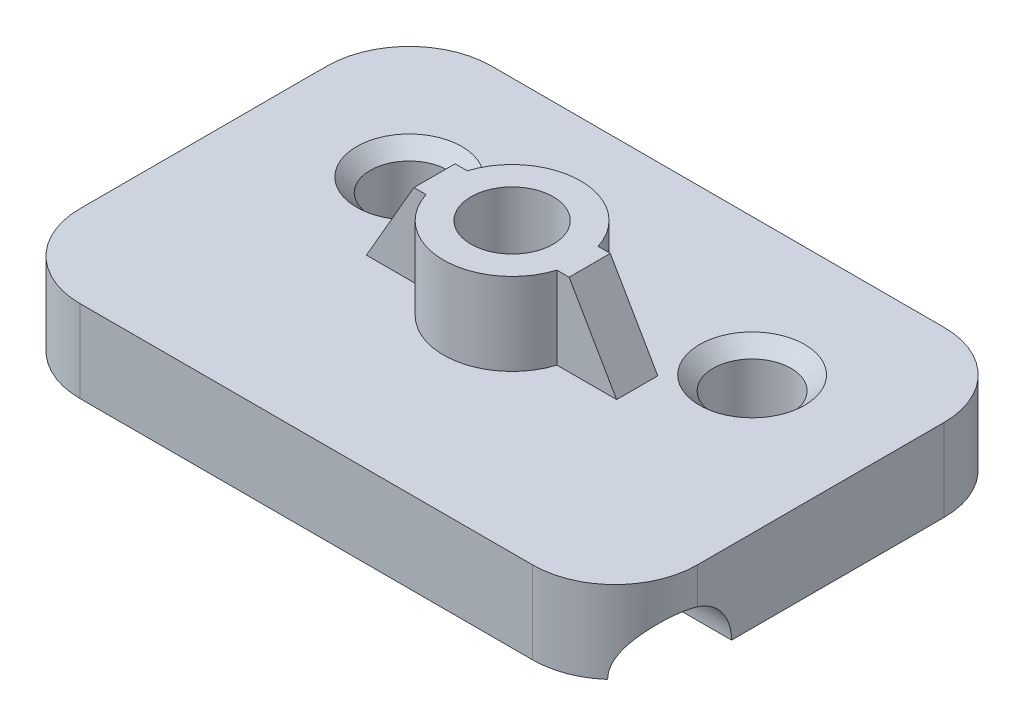
ISO-10303-21;
HEADER;
FILE_DESCRIPTION(('STEP AP214'),'2;1');
FILE_NAME('part.step','',(''),(''),'','','');
FILE_SCHEMA(('AUTOMOTIVE_DESIGN { 1 0 10303 214 1 1 1 1 }'));
ENDSEC;
DATA;
#1=APPLICATION_CONTEXT('core data for automotive mechanical design processes');
#2=APPLICATION_PROTOCOL_DEFINITION('international standard','automotive_design',2000,#1);
#3=PRODUCT_CONTEXT('',#1,'mechanical');
#4=PRODUCT('Part','Part','',(#3));
#5=PRODUCT_RELATED_PRODUCT_CATEGORY('part','',(#4));
#6=PRODUCT_DEFINITION_FORMATION('','',#4);
#7=PRODUCT_DEFINITION_CONTEXT('part definition',#1,'design');
#8=PRODUCT_DEFINITION('design','',#6,#7);
#9=PRODUCT_DEFINITION_SHAPE('','',#8);
#10=(LENGTH_UNIT() NAMED_UNIT(*) SI_UNIT(.MILLI.,.METRE.));
#11=(NAMED_UNIT(*) PLANE_ANGLE_UNIT() SI_UNIT($,.RADIAN.));
#12=(NAMED_UNIT(*) SI_UNIT($,.STERADIAN.) SOLID_ANGLE_UNIT());
#13=UNCERTAINTY_MEASURE_WITH_UNIT(LENGTH_MEASURE(1.E-05),#10,'distance_accuracy_value','');
#14=(GEOMETRIC_REPRESENTATION_CONTEXT(3) GLOBAL_UNCERTAINTY_ASSIGNED_CONTEXT((#13)) GLOBAL_UNIT_ASSIGNED_CONTEXT((#10,
#11,#12)) REPRESENTATION_CONTEXT('',''));
#15=CARTESIAN_POINT('',(0.,0.,0.));
#16=DIRECTION('',(0.,0.,1.));
#17=DIRECTION('',(1.,0.,0.));
#18=AXIS2_PLACEMENT_3D('',#15,#16,#17);
#19=CARTESIAN_POINT('',(-16.5,0.,-9.));
#20=DIRECTION('',(0.,-1.,0.));
#21=DIRECTION('',(0.,0.,-1.));
#22=AXIS2_PLACEMENT_3D('',#19,#20,#21);
#23=PLANE('',#22);
#24=CARTESIAN_POINT('',(12.5,0.,-5.));
#25=DIRECTION('',(0.,-1.,0.));
#26=DIRECTION('',(0.,0.,-1.));
#27=AXIS2_PLACEMENT_3D('',#24,#25,#26);
#28=CIRCLE('',#27,3.8381748737515);
#29=CARTESIAN_POINT('',(12.5,0.,-8.8381748737515));
#30=VERTEX_POINT('',#29);
#31=EDGE_CURVE('E244',#30,#30,#28,.F.);
#32=ORIENTED_EDGE('',*,*,#31,.T.);
#33=EDGE_LOOP('',(#32));
#34=FACE_BOUND('',#33,.T.);
#35=CARTESIAN_POINT('',(-12.5,0.,-5.));
#36=DIRECTION('',(0.,-1.,0.));
#37=DIRECTION('',(0.,0.,-1.));
#38=AXIS2_PLACEMENT_3D('',#35,#36,#37);
#39=CIRCLE('',#38,3.8381748737515);
#40=CARTESIAN_POINT('',(-12.5,0.,-8.8381748737515));
#41=VERTEX_POINT('',#40);
#42=EDGE_CURVE('E241',#41,#41,#39,.F.);
#43=ORIENTED_EDGE('',*,*,#42,.T.);
#44=EDGE_LOOP('',(#43));
#45=FACE_BOUND('',#44,.T.);
#46=DIRECTION('',(1.,0.,0.));
#47=VECTOR('',#46,1.);
#48=CARTESIAN_POINT('',(-32.3994949366117,0.,6.5));
#49=LINE('',#48,#47);
#50=CARTESIAN_POINT('',(-22.5,0.,6.5));
#51=VERTEX_POINT('',#50);
#52=CARTESIAN_POINT('',(22.5,0.,6.5));
#53=VERTEX_POINT('',#52);
#54=EDGE_CURVE('E49',#51,#53,#49,.T.);
#55=ORIENTED_EDGE('',*,*,#54,.F.);
#56=DIRECTION('',(0.,0.,1.));
#57=VECTOR('',#56,1.);
#58=CARTESIAN_POINT('',(-22.5,0.,-8.99999999999996));
#59=LINE('',#58,#57);
#60=CARTESIAN_POINT('',(-22.5,0.,-8.99999999999996));
#61=VERTEX_POINT('',#60);
#62=EDGE_CURVE('E172',#61,#51,#59,.T.);
#63=ORIENTED_EDGE('',*,*,#62,.F.);
#64=CARTESIAN_POINT('',(-16.5,0.,-9.));
#65=DIRECTION('',(0.,1.,0.));
#66=DIRECTION('',(0.,0.,-1.));
#67=AXIS2_PLACEMENT_3D('',#64,#65,#66);
#68=CIRCLE('',#67,6.);
#69=CARTESIAN_POINT('',(-16.5,0.,-15.));
#70=VERTEX_POINT('',#69);
#71=EDGE_CURVE('E183',#70,#61,#68,.T.);
#72=ORIENTED_EDGE('',*,*,#71,.F.);
#73=DIRECTION('',(-1.,0.,0.));
#74=VECTOR('',#73,1.);
#75=CARTESIAN_POINT('',(-16.5,0.,-15.));
#76=LINE('',#75,#74);
#77=CARTESIAN_POINT('',(16.5,0.,-15.));
#78=VERTEX_POINT('',#77);
#79=EDGE_CURVE('E198',#78,#70,#76,.T.);
#80=ORIENTED_EDGE('',*,*,#79,.F.);
#81=CARTESIAN_POINT('',(16.5,0.,-9.));
#82=DIRECTION('',(0.,1.,0.));
#83=DIRECTION('',(0.,0.,1.));
#84=AXIS2_PLACEMENT_3D('',#81,#82,#83);
#85=CIRCLE('',#84,6.);
#86=CARTESIAN_POINT('',(22.5,0.,-8.99999999999996));
#87=VERTEX_POINT('',#86);
#88=EDGE_CURVE('E196',#87,#78,#85,.T.);
#89=ORIENTED_EDGE('',*,*,#88,.F.);
#90=DIRECTION('',(0.,0.,-1.));
#91=VECTOR('',#90,1.);
#92=CARTESIAN_POINT('',(22.5,0.,-8.99999999999996));
#93=LINE('',#92,#91);
#94=EDGE_CURVE('E175',#53,#87,#93,.T.);
#95=ORIENTED_EDGE('',*,*,#94,.F.);
#96=EDGE_LOOP('',(#55,#63,#72,#80,#89,#95));
#97=FACE_BOUND('',#96,.T.);
#98=CARTESIAN_POINT('',(0.,0.,0.));
#99=DIRECTION('',(0.,1.,0.));
#100=DIRECTION('',(0.,0.,1.));
#101=AXIS2_PLACEMENT_3D('',#98,#99,#100);
#102=CIRCLE('',#101,3.);
#103=CARTESIAN_POINT('',(0.,0.,3.));
#104=VERTEX_POINT('',#103);
#105=EDGE_CURVE('E187',#104,#104,#102,.T.);
#106=ORIENTED_EDGE('',*,*,#105,.T.);
#107=EDGE_LOOP('',(#106));
#108=FACE_BOUND('',#107,.T.);
#109=ADVANCED_FACE('F34',(#34,#45,#97,#108),#23,.T.);
#110=CARTESIAN_POINT('',(0.,12.,0.));
#111=DIRECTION('',(0.,-1.,0.));
#112=DIRECTION('',(0.,0.,-1.));
#113=AXIS2_PLACEMENT_3D('',#110,#111,#112);
#114=CYLINDRICAL_SURFACE('',#113,5.);
#115=DIRECTION('',(0.,-1.,0.));
#116=VECTOR('',#115,1.);
#117=CARTESIAN_POINT('',(4.76969600708473,12.,-1.5));
#118=LINE('',#117,#116);
#119=CARTESIAN_POINT('',(4.76969600708473,6.,-1.5));
#120=VERTEX_POINT('',#119);
#121=CARTESIAN_POINT('',(4.76969600708473,12.,-1.5));
#122=VERTEX_POINT('',#121);
#123=EDGE_CURVE('E230',#120,#122,#118,.F.);
#124=ORIENTED_EDGE('',*,*,#123,.F.);
#125=CARTESIAN_POINT('',(0.,6.,0.));
#126=DIRECTION('',(0.,1.,0.));
#127=DIRECTION('',(0.,0.,1.));
#128=AXIS2_PLACEMENT_3D('',#125,#126,#127);
#129=CIRCLE('',#128,5.);
#130=CARTESIAN_POINT('',(-4.76969600708473,6.,-1.5));
#131=VERTEX_POINT('',#130);
#132=EDGE_CURVE('E223',#120,#131,#129,.T.);
#133=ORIENTED_EDGE('',*,*,#132,.T.);
#134=DIRECTION('',(0.,-1.,0.));
#135=VECTOR('',#134,1.);
#136=CARTESIAN_POINT('',(-4.76969600708473,12.,-1.5));
#137=LINE('',#136,#135);
#138=CARTESIAN_POINT('',(-4.76969600708473,12.,-1.5));
#139=VERTEX_POINT('',#138);
#140=EDGE_CURVE('E224',#139,#131,#137,.T.);
#141=ORIENTED_EDGE('',*,*,#140,.F.);
#142=CARTESIAN_POINT('',(0.,12.,0.));
#143=DIRECTION('',(0.,1.,0.));
#144=DIRECTION('',(0.,0.,1.));
#145=AXIS2_PLACEMENT_3D('',#142,#143,#144);
#146=CIRCLE('',#145,5.);
#147=EDGE_CURVE('E607',#122,#139,#146,.T.);
#148=ORIENTED_EDGE('',*,*,#147,.F.);
#149=EDGE_LOOP('',(#124,#133,#141,#148));
#150=FACE_BOUND('',#149,.T.);
#151=ADVANCED_FACE('F267',(#150),#114,.T.);
#152=CARTESIAN_POINT('',(-16.5,6.,-9.));
#153=DIRECTION('',(0.,-1.,0.));
#154=DIRECTION('',(0.,0.,-1.));
#155=AXIS2_PLACEMENT_3D('',#152,#153,#154);
#156=PLANE('',#155);
#157=CARTESIAN_POINT('',(-12.5,6.,-5.));
#158=DIRECTION('',(0.,-1.,0.));
#159=DIRECTION('',(0.,0.,-1.));
#160=AXIS2_PLACEMENT_3D('',#157,#158,#159);
#161=CIRCLE('',#160,3.8381748737515);
#162=CARTESIAN_POINT('',(-12.5,6.,-8.83817487375149));
#163=VERTEX_POINT('',#162);
#164=EDGE_CURVE('E11',#163,#163,#161,.T.);
#165=ORIENTED_EDGE('',*,*,#164,.T.);
#166=EDGE_LOOP('',(#165));
#167=FACE_BOUND('',#166,.T.);
#168=CARTESIAN_POINT('',(12.5,6.,-5.));
#169=DIRECTION('',(0.,-1.,0.));
#170=DIRECTION('',(0.,0.,-1.));
#171=AXIS2_PLACEMENT_3D('',#168,#169,#170);
#172=CIRCLE('',#171,3.8381748737515);
#173=CARTESIAN_POINT('',(12.5,6.,-8.83817487375149));
#174=VERTEX_POINT('',#173);
#175=EDGE_CURVE('E42',#174,#174,#172,.T.);
#176=ORIENTED_EDGE('',*,*,#175,.T.);
#177=EDGE_LOOP('',(#176));
#178=FACE_BOUND('',#177,.T.);
#179=DIRECTION('',(0.,0.,-1.));
#180=VECTOR('',#179,1.);
#181=CARTESIAN_POINT('',(9.1218522547401,6.,1.5));
#182=LINE('',#181,#180);
#183=CARTESIAN_POINT('',(9.1218522547401,6.,1.5));
#184=VERTEX_POINT('',#183);
#185=CARTESIAN_POINT('',(9.1218522547401,6.,-1.5));
#186=VERTEX_POINT('',#185);
#187=EDGE_CURVE('E57',#184,#186,#182,.T.);
#188=ORIENTED_EDGE('',*,*,#187,.F.);
#189=DIRECTION('',(1.,0.,0.));
#190=VECTOR('',#189,1.);
#191=CARTESIAN_POINT('',(3.79854534632678,6.,1.5));
#192=LINE('',#191,#190);
#193=CARTESIAN_POINT('',(4.76969600708473,6.,1.5));
#194=VERTEX_POINT('',#193);
#195=EDGE_CURVE('E645',#194,#184,#192,.T.);
#196=ORIENTED_EDGE('',*,*,#195,.F.);
#197=CARTESIAN_POINT('',(-4.76969600708473,6.,1.5));
#198=VERTEX_POINT('',#197);
#199=EDGE_CURVE('E228',#198,#194,#129,.T.);
#200=ORIENTED_EDGE('',*,*,#199,.F.);
#201=DIRECTION('',(1.,0.,0.));
#202=VECTOR('',#201,1.);
#203=CARTESIAN_POINT('',(-3.79854534632678,6.,1.5));
#204=LINE('',#203,#202);
#205=CARTESIAN_POINT('',(-9.1218522547401,6.,1.5));
#206=VERTEX_POINT('',#205);
#207=EDGE_CURVE('E620',#206,#198,#204,.T.);
#208=ORIENTED_EDGE('',*,*,#207,.F.);
#209=DIRECTION('',(0.,0.,-1.));
#210=VECTOR('',#209,1.);
#211=CARTESIAN_POINT('',(-9.1218522547401,6.,1.5));
#212=LINE('',#211,#210);
#213=CARTESIAN_POINT('',(-9.1218522547401,6.,-1.5));
#214=VERTEX_POINT('',#213);
#215=EDGE_CURVE('E614',#206,#214,#212,.T.);
#216=ORIENTED_EDGE('',*,*,#215,.T.);
#217=DIRECTION('',(1.,0.,0.));
#218=VECTOR('',#217,1.);
#219=CARTESIAN_POINT('',(-3.79854534632678,6.,-1.5));
#220=LINE('',#219,#218);
#221=EDGE_CURVE('E623',#214,#131,#220,.T.);
#222=ORIENTED_EDGE('',*,*,#221,.T.);
#223=ORIENTED_EDGE('',*,*,#132,.F.);
#224=DIRECTION('',(1.,0.,0.));
#225=VECTOR('',#224,1.);
#226=CARTESIAN_POINT('',(3.79854534632678,6.,-1.5));
#227=LINE('',#226,#225);
#228=EDGE_CURVE('E640',#120,#186,#227,.T.);
#229=ORIENTED_EDGE('',*,*,#228,.T.);
#230=EDGE_LOOP('',(#188,#196,#200,#208,#216,#222,#223,#229));
#231=FACE_BOUND('',#230,.T.);
#232=CARTESIAN_POINT('',(-16.5,6.,-9.));
#233=DIRECTION('',(0.,1.,0.));
#234=DIRECTION('',(0.,0.,-1.));
#235=AXIS2_PLACEMENT_3D('',#232,#233,#234);
#236=CIRCLE('',#235,6.);
#237=CARTESIAN_POINT('',(-16.5,6.,-15.));
#238=VERTEX_POINT('',#237);
#239=CARTESIAN_POINT('',(-22.5,6.,-8.99999999999996));
#240=VERTEX_POINT('',#239);
#241=EDGE_CURVE('E200',#238,#240,#236,.T.);
#242=ORIENTED_EDGE('',*,*,#241,.T.);
#243=DIRECTION('',(0.,0.,1.));
#244=VECTOR('',#243,1.);
#245=CARTESIAN_POINT('',(-22.5,6.,-8.99999999999996));
#246=LINE('',#245,#244);
#247=CARTESIAN_POINT('',(-22.5,6.,8.99999999999996));
#248=VERTEX_POINT('',#247);
#249=EDGE_CURVE('E595',#240,#248,#246,.T.);
#250=ORIENTED_EDGE('',*,*,#249,.T.);
#251=CARTESIAN_POINT('',(-16.5,6.,9.));
#252=DIRECTION('',(0.,1.,0.));
#253=DIRECTION('',(0.,0.,-1.));
#254=AXIS2_PLACEMENT_3D('',#251,#252,#253);
#255=CIRCLE('',#254,6.);
#256=CARTESIAN_POINT('',(-16.5,6.,15.));
#257=VERTEX_POINT('',#256);
#258=EDGE_CURVE('E311',#248,#257,#255,.T.);
#259=ORIENTED_EDGE('',*,*,#258,.T.);
#260=DIRECTION('',(1.,0.,0.));
#261=VECTOR('',#260,1.);
#262=CARTESIAN_POINT('',(-16.5,6.,15.));
#263=LINE('',#262,#261);
#264=CARTESIAN_POINT('',(16.5,6.,15.));
#265=VERTEX_POINT('',#264);
#266=EDGE_CURVE('E306',#257,#265,#263,.T.);
#267=ORIENTED_EDGE('',*,*,#266,.T.);
#268=CARTESIAN_POINT('',(16.5,6.,9.));
#269=DIRECTION('',(0.,1.,0.));
#270=DIRECTION('',(0.,0.,1.));
#271=AXIS2_PLACEMENT_3D('',#268,#269,#270);
#272=CIRCLE('',#271,6.);
#273=CARTESIAN_POINT('',(22.5,6.,8.99999999999996));
#274=VERTEX_POINT('',#273);
#275=EDGE_CURVE('E302',#265,#274,#272,.T.);
#276=ORIENTED_EDGE('',*,*,#275,.T.);
#277=DIRECTION('',(0.,0.,-1.));
#278=VECTOR('',#277,1.);
#279=CARTESIAN_POINT('',(22.5,6.,-8.99999999999996));
#280=LINE('',#279,#278);
#281=CARTESIAN_POINT('',(22.5,6.,-8.99999999999996));
#282=VERTEX_POINT('',#281);
#283=EDGE_CURVE('E581',#274,#282,#280,.T.);
#284=ORIENTED_EDGE('',*,*,#283,.T.);
#285=CARTESIAN_POINT('',(16.5,6.,-9.));
#286=DIRECTION('',(0.,1.,0.));
#287=DIRECTION('',(0.,0.,1.));
#288=AXIS2_PLACEMENT_3D('',#285,#286,#287);
#289=CIRCLE('',#288,6.);
#290=CARTESIAN_POINT('',(16.5,6.,-15.));
#291=VERTEX_POINT('',#290);
#292=EDGE_CURVE('E584',#282,#291,#289,.T.);
#293=ORIENTED_EDGE('',*,*,#292,.T.);
#294=DIRECTION('',(-1.,0.,0.));
#295=VECTOR('',#294,1.);
#296=CARTESIAN_POINT('',(-16.5,6.,-15.));
#297=LINE('',#296,#295);
#298=EDGE_CURVE('E205',#291,#238,#297,.T.);
#299=ORIENTED_EDGE('',*,*,#298,.T.);
#300=EDGE_LOOP('',(#242,#250,#259,#267,#276,#284,#293,#299));
#301=FACE_BOUND('',#300,.T.);
#302=ADVANCED_FACE('F255',(#167,#178,#231,#301),#156,.F.);
#303=DIRECTION('',(1.,0.,0.));
#304=VECTOR('',#303,1.);
#305=CARTESIAN_POINT('',(-32.3994949366117,0.,13.5));
#306=LINE('',#305,#304);
#307=CARTESIAN_POINT('',(20.4686269665969,0.,13.5));
#308=VERTEX_POINT('',#307);
#309=CARTESIAN_POINT('',(-20.4686269665969,0.,13.5));
#310=VERTEX_POINT('',#309);
#311=EDGE_CURVE('E293',#308,#310,#306,.F.);
#312=ORIENTED_EDGE('',*,*,#311,.F.);
#313=CARTESIAN_POINT('',(16.5,0.,9.));
#314=DIRECTION('',(0.,1.,0.));
#315=DIRECTION('',(0.,0.,1.));
#316=AXIS2_PLACEMENT_3D('',#313,#314,#315);
#317=CIRCLE('',#316,6.);
#318=CARTESIAN_POINT('',(16.5,0.,15.));
#319=VERTEX_POINT('',#318);
#320=EDGE_CURVE('E192',#319,#308,#317,.T.);
#321=ORIENTED_EDGE('',*,*,#320,.F.);
#322=DIRECTION('',(1.,0.,0.));
#323=VECTOR('',#322,1.);
#324=CARTESIAN_POINT('',(-16.5,0.,15.));
#325=LINE('',#324,#323);
#326=CARTESIAN_POINT('',(-16.5,0.,15.));
#327=VERTEX_POINT('',#326);
#328=EDGE_CURVE('E185',#327,#319,#325,.T.);
#329=ORIENTED_EDGE('',*,*,#328,.F.);
#330=CARTESIAN_POINT('',(-16.5,0.,9.));
#331=DIRECTION('',(0.,1.,0.));
#332=DIRECTION('',(0.,0.,-1.));
#333=AXIS2_PLACEMENT_3D('',#330,#331,#332);
#334=CIRCLE('',#333,6.);
#335=EDGE_CURVE('E182',#310,#327,#334,.T.);
#336=ORIENTED_EDGE('',*,*,#335,.F.);
#337=EDGE_LOOP('',(#312,#321,#329,#336));
#338=FACE_BOUND('',#337,.T.);
#339=ADVANCED_FACE('F270',(#338),#23,.T.);
#340=CARTESIAN_POINT('',(-16.5,6.,-9.));
#341=DIRECTION('',(0.,-1.,0.));
#342=DIRECTION('',(0.,0.,-1.));
#343=AXIS2_PLACEMENT_3D('',#340,#341,#342);
#344=CYLINDRICAL_SURFACE('',#343,6.);
#345=ORIENTED_EDGE('',*,*,#71,.T.);
#346=DIRECTION('',(0.,-1.,0.));
#347=VECTOR('',#346,1.);
#348=CARTESIAN_POINT('',(-22.5,6.,-8.99999999999996));
#349=LINE('',#348,#347);
#350=EDGE_CURVE('E180',#240,#61,#349,.T.);
#351=ORIENTED_EDGE('',*,*,#350,.F.);
#352=ORIENTED_EDGE('',*,*,#241,.F.);
#353=DIRECTION('',(0.,-1.,0.));
#354=VECTOR('',#353,1.);
#355=CARTESIAN_POINT('',(-16.5,6.,-15.));
#356=LINE('',#355,#354);
#357=EDGE_CURVE('E201',#238,#70,#356,.T.);
#358=ORIENTED_EDGE('',*,*,#357,.T.);
#359=EDGE_LOOP('',(#345,#351,#352,#358));
#360=FACE_BOUND('',#359,.T.);
#361=ADVANCED_FACE('F281',(#360),#344,.T.);
#362=CARTESIAN_POINT('',(-22.5,6.,-8.99999999999996));
#363=DIRECTION('',(1.,0.,0.));
#364=DIRECTION('',(0.,0.,-1.));
#365=AXIS2_PLACEMENT_3D('',#362,#363,#364);
#366=PLANE('',#365);
#367=ORIENTED_EDGE('',*,*,#62,.T.);
#368=CARTESIAN_POINT('',(-22.5,0.,10.));
#369=DIRECTION('',(1.,0.,0.));
#370=DIRECTION('',(0.,0.,-1.));
#371=AXIS2_PLACEMENT_3D('',#368,#369,#370);
#372=CIRCLE('',#371,3.5);
#373=CARTESIAN_POINT('',(-22.5,3.35410196624968,9.));
#374=VERTEX_POINT('',#373);
#375=EDGE_CURVE('E157',#374,#51,#372,.F.);
#376=ORIENTED_EDGE('',*,*,#375,.F.);
#377=DIRECTION('',(0.,-1.,0.));
#378=VECTOR('',#377,1.);
#379=CARTESIAN_POINT('',(-22.5,6.,8.99999999999996));
#380=LINE('',#379,#378);
#381=EDGE_CURVE('E220',#248,#374,#380,.T.);
#382=ORIENTED_EDGE('',*,*,#381,.F.);
#383=ORIENTED_EDGE('',*,*,#249,.F.);
#384=ORIENTED_EDGE('',*,*,#350,.T.);
#385=EDGE_LOOP('',(#367,#376,#382,#383,#384));
#386=FACE_BOUND('',#385,.T.);
#387=ADVANCED_FACE('F178',(#386),#366,.F.);
#388=CARTESIAN_POINT('',(-16.5,6.,9.));
#389=DIRECTION('',(0.,-1.,0.));
#390=DIRECTION('',(0.,0.,-1.));
#391=AXIS2_PLACEMENT_3D('',#388,#389,#390);
#392=CYLINDRICAL_SURFACE('',#391,6.);
#393=ORIENTED_EDGE('',*,*,#381,.T.);
#394=CARTESIAN_POINT('',(-22.5,3.35410196624967,8.99999999999996));
#395=CARTESIAN_POINT('',(-22.5000153224947,3.37923924743067,9.08426082111713));
#396=CARTESIAN_POINT('',(-22.498225362984,3.40117308835589,9.16947786275634));
#397=CARTESIAN_POINT('',(-22.4909053674447,3.43854773486139,9.34115345622795));
#398=CARTESIAN_POINT('',(-22.4853758373783,3.45398941836897,9.42761183855889));
#399=CARTESIAN_POINT('',(-22.4704795034489,3.47824793727962,9.60074761001633));
#400=CARTESIAN_POINT('',(-22.461129377248,3.48709309957827,9.68742244014785));
#401=CARTESIAN_POINT('',(-22.438594170311,3.49830427135211,9.86066654012441));
#402=CARTESIAN_POINT('',(-22.4254091847197,3.50067044155904,9.9472358125349));
#403=CARTESIAN_POINT('',(-22.3801763990831,3.49818011900146,10.2058226957985));
#404=CARTESIAN_POINT('',(-22.3424376996476,3.48375566444798,10.3768722536701));
#405=CARTESIAN_POINT('',(-22.2533317979319,3.43111348807245,10.711514042865));
#406=CARTESIAN_POINT('',(-22.2019553179577,3.39287954488635,10.8751011083879));
#407=CARTESIAN_POINT('',(-22.0855957692794,3.29305689740419,11.1981332507593));
#408=CARTESIAN_POINT('',(-22.0201366065313,3.23056502683311,11.3571248797767));
#409=CARTESIAN_POINT('',(-21.8801655317774,3.08527363162274,11.6611829393199));
#410=CARTESIAN_POINT('',(-21.8056489467897,3.00246360163359,11.8062421120154));
#411=CARTESIAN_POINT('',(-21.6381394339971,2.80380408271344,12.1037451431088));
#412=CARTESIAN_POINT('',(-21.5441237331029,2.68476032109828,12.253477457283));
#413=CARTESIAN_POINT('',(-21.3538081482058,2.42478946671638,12.5311334025296));
#414=CARTESIAN_POINT('',(-21.2575059675333,2.28383950769199,12.659033948946));
#415=CARTESIAN_POINT('',(-21.0732487152937,1.98765488258145,12.8866309407066));
#416=CARTESIAN_POINT('',(-20.985112881475,1.83327563923652,12.9872908910079));
#417=CARTESIAN_POINT('',(-20.8205689981406,1.50577009761068,13.1650073615941));
#418=CARTESIAN_POINT('',(-20.7441417541962,1.33267529293189,13.242102723467));
#419=CARTESIAN_POINT('',(-20.6322604174454,1.02058867864691,13.3507143732209));
#420=CARTESIAN_POINT('',(-20.5913381835675,0.885971643081313,13.388959476829));
#421=CARTESIAN_POINT('',(-20.5419910640441,0.678785702481595,13.4342753373418));
#422=CARTESIAN_POINT('',(-20.5275570800473,0.608924415752774,13.4473644193252));
#423=CARTESIAN_POINT('',(-20.503166445183,0.467786808938955,13.469332259572));
#424=CARTESIAN_POINT('',(-20.4932073677945,0.396511277676902,13.4782132997915));
#425=CARTESIAN_POINT('',(-20.4800472464072,0.271019864445042,13.4899089280472));
#426=CARTESIAN_POINT('',(-20.4757783417054,0.217002127374019,13.4936857906826));
#427=CARTESIAN_POINT('',(-20.4700616935934,0.108660004179806,13.4987346908511));
#428=CARTESIAN_POINT('',(-20.4686161244438,0.0543354140085731,13.5000047979308));
#429=CARTESIAN_POINT('',(-20.4686269665969,0.,13.5));
#430=B_SPLINE_CURVE_WITH_KNOTS('',3,(#394,#395,#396,#397,#398,#399,#400,#401,#402,#403,#404,
#405,#406,#407,#408,#409,#410,#411,#412,#413,#414,#415,#416,#417,#418,#419,#420,#421,#422,#423,
#424,#425,#426,#427,#428,#429),.UNSPECIFIED.,.F.,.F.,(4,2,2,2,2,2,2,2,2,2,2,2,2,2,2,2,2,4),(0.,
0.263709931809797,0.527384190937012,0.789919550680825,1.05244839735187,1.57704760178794,
2.10200460638075,2.64874191881365,3.19576251553279,3.8327813906502,4.47046972468058,
5.08120868233544,5.69093545967552,6.12656472637051,6.34391549760354,6.56114826758785,
6.72397553392444,6.88692814475175),.UNSPECIFIED.);
#431=EDGE_CURVE('E160',#374,#310,#430,.T.);
#432=ORIENTED_EDGE('',*,*,#431,.T.);
#433=ORIENTED_EDGE('',*,*,#335,.T.);
#434=DIRECTION('',(0.,-1.,0.));
#435=VECTOR('',#434,1.);
#436=CARTESIAN_POINT('',(-16.5,6.,15.));
#437=LINE('',#436,#435);
#438=EDGE_CURVE('E217',#257,#327,#437,.T.);
#439=ORIENTED_EDGE('',*,*,#438,.F.);
#440=ORIENTED_EDGE('',*,*,#258,.F.);
#441=EDGE_LOOP('',(#393,#432,#433,#439,#440));
#442=FACE_BOUND('',#441,.T.);
#443=ADVANCED_FACE('F310',(#442),#392,.T.);
#444=CARTESIAN_POINT('',(-16.5,6.,15.));
#445=DIRECTION('',(0.,0.,-1.));
#446=DIRECTION('',(-1.,0.,0.));
#447=AXIS2_PLACEMENT_3D('',#444,#445,#446);
#448=PLANE('',#447);
#449=ORIENTED_EDGE('',*,*,#328,.T.);
#450=DIRECTION('',(0.,-1.,0.));
#451=VECTOR('',#450,1.);
#452=CARTESIAN_POINT('',(16.5,6.,15.));
#453=LINE('',#452,#451);
#454=EDGE_CURVE('E214',#265,#319,#453,.T.);
#455=ORIENTED_EDGE('',*,*,#454,.F.);
#456=ORIENTED_EDGE('',*,*,#266,.F.);
#457=ORIENTED_EDGE('',*,*,#438,.T.);
#458=EDGE_LOOP('',(#449,#455,#456,#457));
#459=FACE_BOUND('',#458,.T.);
#460=ADVANCED_FACE('F305',(#459),#448,.F.);
#461=CARTESIAN_POINT('',(16.5,6.,9.));
#462=DIRECTION('',(0.,-1.,0.));
#463=DIRECTION('',(0.,0.,-1.));
#464=AXIS2_PLACEMENT_3D('',#461,#462,#463);
#465=CYLINDRICAL_SURFACE('',#464,6.);
#466=ORIENTED_EDGE('',*,*,#320,.T.);
#467=CARTESIAN_POINT('',(20.4686269665969,0.,13.5));
#468=CARTESIAN_POINT('',(20.4685712039067,0.0811836789860392,13.5000257506439));
#469=CARTESIAN_POINT('',(20.4718282121924,0.162329044487945,13.497176599036));
#470=CARTESIAN_POINT('',(20.4845324652196,0.323601852641668,13.4859367013396));
#471=CARTESIAN_POINT('',(20.4939683043637,0.403730894071723,13.4775561654911));
#472=CARTESIAN_POINT('',(20.5184342567479,0.561281027742784,13.4556070891319));
#473=CARTESIAN_POINT('',(20.5333883915866,0.63872395233526,13.4421089439923));
#474=CARTESIAN_POINT('',(20.568222947562,0.791471676682588,13.4102293771496));
#475=CARTESIAN_POINT('',(20.5881054123613,0.866775574958126,13.3918459293979));
#476=CARTESIAN_POINT('',(20.6536993783797,1.08776854539035,13.3301677907789));
#477=CARTESIAN_POINT('',(20.7055751510283,1.229802097449,13.2801604766396));
#478=CARTESIAN_POINT('',(20.8203045893178,1.50306775684367,13.1643273471022));
#479=CARTESIAN_POINT('',(20.8832051635746,1.63425003425724,13.098433468148));
#480=CARTESIAN_POINT('',(20.9989152295835,1.85411871141838,12.9705510341757));
#481=CARTESIAN_POINT('',(21.0503914061895,1.9453107008697,12.9116020192364));
#482=CARTESIAN_POINT('',(21.155327226413,2.12114929537035,12.7861083194756));
#483=CARTESIAN_POINT('',(21.2087876093891,2.205793423563,12.7195607837055));
#484=CARTESIAN_POINT('',(21.3163653592318,2.36842338724648,12.5791693065101));
#485=CARTESIAN_POINT('',(21.3704830321546,2.44640597361698,12.5053218420484));
#486=CARTESIAN_POINT('',(21.4782274837656,2.59547498228236,12.3505443452286));
#487=CARTESIAN_POINT('',(21.531854004249,2.66655794687698,12.2696107999752));
#488=CARTESIAN_POINT('',(21.6379514809875,2.80193042075008,12.1002445336585));
#489=CARTESIAN_POINT('',(21.6904102395758,2.86616292749183,12.0117584887584));
#490=CARTESIAN_POINT('',(21.7927185030769,2.98665214846273,11.8281055305886));
#491=CARTESIAN_POINT('',(21.842568351832,3.04290991540447,11.7329395016006));
#492=CARTESIAN_POINT('',(21.9385966083732,3.14668475247636,11.5364515642217));
#493=CARTESIAN_POINT('',(21.9847820212543,3.19421873965918,11.4351420880221));
#494=CARTESIAN_POINT('',(22.0726181935739,3.2798798185924,11.2268210678515));
#495=CARTESIAN_POINT('',(22.1142706568848,3.31801045180324,11.1198116890794));
#496=CARTESIAN_POINT('',(22.2114493051305,3.40039187451293,10.8464543107918));
#497=CARTESIAN_POINT('',(22.2636655051514,3.43836204306592,10.6769053078046));
#498=CARTESIAN_POINT('',(22.3309181947735,3.47615230613121,10.4172004513612));
#499=CARTESIAN_POINT('',(22.3514906249361,3.485554893903,10.3297344623024));
#500=CARTESIAN_POINT('',(22.3887551065579,3.49774304233041,10.153535597311));
#501=CARTESIAN_POINT('',(22.405449031831,3.50053180433148,10.0648033552267));
#502=CARTESIAN_POINT('',(22.4335750432093,3.49935183365441,9.89416687107595));
#503=CARTESIAN_POINT('',(22.4453300989334,3.49592790852018,9.81231115525161));
#504=CARTESIAN_POINT('',(22.4654072036045,3.48328487511261,9.64862584201443));
#505=CARTESIAN_POINT('',(22.4737294325341,3.47406607072822,9.5667962434571));
#506=CARTESIAN_POINT('',(22.4869840717032,3.4497738457935,9.40342666369023));
#507=CARTESIAN_POINT('',(22.4919039489604,3.43467909607856,9.32188884244028));
#508=CARTESIAN_POINT('',(22.4984184767825,3.39870842704295,9.15994945122303));
#509=CARTESIAN_POINT('',(22.5000125892987,3.37783157290109,9.07954806720018));
#510=CARTESIAN_POINT('',(22.5,3.35410196624967,8.99999999999996));
#511=B_SPLINE_CURVE_WITH_KNOTS('',3,(#467,#468,#469,#470,#471,#472,#473,#474,#475,#476,#477,
#478,#479,#480,#481,#482,#483,#484,#485,#486,#487,#488,#489,#490,#491,#492,#493,#494,#495,#496,
#497,#498,#499,#500,#501,#502,#503,#504,#505,#506,#507,#508,#509,#510),.UNSPECIFIED.,.F.,.F.,(4,
2,2,2,2,2,2,2,2,2,2,2,2,2,2,2,2,2,2,2,2,4),(0.,0.243374336470819,0.48630068619777,
0.72600004500998,0.965798968288866,1.44156335990039,1.91940349184482,2.27948375399214,
2.63969956418898,3.00009007573786,3.36066027211733,3.72402871595245,4.08734914825686,
4.4499574125265,4.81242890317947,5.35394673094795,5.62471051966392,5.895343221544,
6.14337806339321,6.39139989914564,6.64033055601176,6.88930148223555),.UNSPECIFIED.);
#512=CARTESIAN_POINT('',(22.5,3.35410196624967,8.99999999999996));
#513=VERTEX_POINT('',#512);
#514=EDGE_CURVE('E165',#308,#513,#511,.T.);
#515=ORIENTED_EDGE('',*,*,#514,.T.);
#516=DIRECTION('',(0.,-1.,0.));
#517=VECTOR('',#516,1.);
#518=CARTESIAN_POINT('',(22.5,6.,8.99999999999996));
#519=LINE('',#518,#517);
#520=EDGE_CURVE('E211',#274,#513,#519,.T.);
#521=ORIENTED_EDGE('',*,*,#520,.F.);
#522=ORIENTED_EDGE('',*,*,#275,.F.);
#523=ORIENTED_EDGE('',*,*,#454,.T.);
#524=EDGE_LOOP('',(#466,#515,#521,#522,#523));
#525=FACE_BOUND('',#524,.T.);
#526=ADVANCED_FACE('F298',(#525),#465,.T.);
#527=CARTESIAN_POINT('',(22.5,6.,-8.99999999999996));
#528=DIRECTION('',(-1.,0.,0.));
#529=DIRECTION('',(0.,0.,1.));
#530=AXIS2_PLACEMENT_3D('',#527,#528,#529);
#531=PLANE('',#530);
#532=ORIENTED_EDGE('',*,*,#520,.T.);
#533=CARTESIAN_POINT('',(22.5,0.,10.));
#534=DIRECTION('',(-1.,0.,0.));
#535=DIRECTION('',(0.,0.,1.));
#536=AXIS2_PLACEMENT_3D('',#533,#534,#535);
#537=CIRCLE('',#536,3.5);
#538=EDGE_CURVE('E166',#513,#53,#537,.T.);
#539=ORIENTED_EDGE('',*,*,#538,.T.);
#540=ORIENTED_EDGE('',*,*,#94,.T.);
#541=DIRECTION('',(0.,-1.,0.));
#542=VECTOR('',#541,1.);
#543=CARTESIAN_POINT('',(22.5,6.,-8.99999999999996));
#544=LINE('',#543,#542);
#545=EDGE_CURVE('E208',#282,#87,#544,.T.);
#546=ORIENTED_EDGE('',*,*,#545,.F.);
#547=ORIENTED_EDGE('',*,*,#283,.F.);
#548=EDGE_LOOP('',(#532,#539,#540,#546,#547));
#549=FACE_BOUND('',#548,.T.);
#550=ADVANCED_FACE('F343',(#549),#531,.F.);
#551=CARTESIAN_POINT('',(16.5,6.,-9.));
#552=DIRECTION('',(0.,-1.,0.));
#553=DIRECTION('',(0.,0.,-1.));
#554=AXIS2_PLACEMENT_3D('',#551,#552,#553);
#555=CYLINDRICAL_SURFACE('',#554,6.);
#556=ORIENTED_EDGE('',*,*,#88,.T.);
#557=DIRECTION('',(0.,-1.,0.));
#558=VECTOR('',#557,1.);
#559=CARTESIAN_POINT('',(16.5,6.,-15.));
#560=LINE('',#559,#558);
#561=EDGE_CURVE('E204',#291,#78,#560,.T.);
#562=ORIENTED_EDGE('',*,*,#561,.F.);
#563=ORIENTED_EDGE('',*,*,#292,.F.);
#564=ORIENTED_EDGE('',*,*,#545,.T.);
#565=EDGE_LOOP('',(#556,#562,#563,#564));
#566=FACE_BOUND('',#565,.T.);
#567=ADVANCED_FACE('F462',(#566),#555,.T.);
#568=CARTESIAN_POINT('',(-16.5,6.,-15.));
#569=DIRECTION('',(0.,0.,1.));
#570=DIRECTION('',(1.,0.,0.));
#571=AXIS2_PLACEMENT_3D('',#568,#569,#570);
#572=PLANE('',#571);
#573=ORIENTED_EDGE('',*,*,#79,.T.);
#574=ORIENTED_EDGE('',*,*,#357,.F.);
#575=ORIENTED_EDGE('',*,*,#298,.F.);
#576=ORIENTED_EDGE('',*,*,#561,.T.);
#577=EDGE_LOOP('',(#573,#574,#575,#576));
#578=FACE_BOUND('',#577,.T.);
#579=ADVANCED_FACE('F454',(#578),#572,.F.);
#580=CARTESIAN_POINT('',(0.,6.,0.));
#581=DIRECTION('',(0.,-1.,0.));
#582=DIRECTION('',(0.,0.,-1.));
#583=AXIS2_PLACEMENT_3D('',#580,#581,#582);
#584=CYLINDRICAL_SURFACE('',#583,3.);
#585=ORIENTED_EDGE('',*,*,#105,.F.);
#586=EDGE_LOOP('',(#585));
#587=FACE_BOUND('',#586,.T.);
#588=CARTESIAN_POINT('',(0.,12.,0.));
#589=DIRECTION('',(0.,1.,0.));
#590=DIRECTION('',(0.,0.,1.));
#591=AXIS2_PLACEMENT_3D('',#588,#589,#590);
#592=CIRCLE('',#591,3.);
#593=CARTESIAN_POINT('',(0.,12.,3.));
#594=VERTEX_POINT('',#593);
#595=EDGE_CURVE('E608',#594,#594,#592,.T.);
#596=ORIENTED_EDGE('',*,*,#595,.T.);
#597=EDGE_LOOP('',(#596));
#598=FACE_BOUND('',#597,.T.);
#599=ADVANCED_FACE('F445',(#587,#598),#584,.F.);
#600=CARTESIAN_POINT('',(0.,12.,0.));
#601=DIRECTION('',(0.,1.,0.));
#602=DIRECTION('',(0.,0.,1.));
#603=AXIS2_PLACEMENT_3D('',#600,#601,#602);
#604=PLANE('',#603);
#605=CARTESIAN_POINT('',(-4.76969600708473,12.,1.5));
#606=VERTEX_POINT('',#605);
#607=CARTESIAN_POINT('',(4.76969600708473,12.,1.5));
#608=VERTEX_POINT('',#607);
#609=EDGE_CURVE('E602',#606,#608,#146,.T.);
#610=ORIENTED_EDGE('',*,*,#609,.T.);
#611=DIRECTION('',(-1.,0.,0.));
#612=VECTOR('',#611,1.);
#613=CARTESIAN_POINT('',(5.65775063960234,12.,1.5));
#614=LINE('',#613,#612);
#615=CARTESIAN_POINT('',(5.65775063960234,12.,1.5));
#616=VERTEX_POINT('',#615);
#617=EDGE_CURVE('E639',#616,#608,#614,.T.);
#618=ORIENTED_EDGE('',*,*,#617,.F.);
#619=DIRECTION('',(0.,0.,-1.));
#620=VECTOR('',#619,1.);
#621=CARTESIAN_POINT('',(5.65775063960234,12.,1.5));
#622=LINE('',#621,#620);
#623=CARTESIAN_POINT('',(5.65775063960234,12.,-1.5));
#624=VERTEX_POINT('',#623);
#625=EDGE_CURVE('E633',#616,#624,#622,.T.);
#626=ORIENTED_EDGE('',*,*,#625,.T.);
#627=DIRECTION('',(-1.,0.,0.));
#628=VECTOR('',#627,1.);
#629=CARTESIAN_POINT('',(5.65775063960234,12.,-1.5));
#630=LINE('',#629,#628);
#631=EDGE_CURVE('E176',#624,#122,#630,.T.);
#632=ORIENTED_EDGE('',*,*,#631,.T.);
#633=ORIENTED_EDGE('',*,*,#147,.T.);
#634=DIRECTION('',(-1.,0.,0.));
#635=VECTOR('',#634,1.);
#636=CARTESIAN_POINT('',(-5.65775063960234,12.,-1.5));
#637=LINE('',#636,#635);
#638=CARTESIAN_POINT('',(-5.65775063960234,12.,-1.5));
#639=VERTEX_POINT('',#638);
#640=EDGE_CURVE('E621',#139,#639,#637,.T.);
#641=ORIENTED_EDGE('',*,*,#640,.T.);
#642=DIRECTION('',(0.,0.,-1.));
#643=VECTOR('',#642,1.);
#644=CARTESIAN_POINT('',(-5.65775063960234,12.,1.5));
#645=LINE('',#644,#643);
#646=CARTESIAN_POINT('',(-5.65775063960234,12.,1.5));
#647=VERTEX_POINT('',#646);
#648=EDGE_CURVE('E611',#647,#639,#645,.T.);
#649=ORIENTED_EDGE('',*,*,#648,.F.);
#650=DIRECTION('',(-1.,0.,0.));
#651=VECTOR('',#650,1.);
#652=CARTESIAN_POINT('',(-5.65775063960234,12.,1.5));
#653=LINE('',#652,#651);
#654=EDGE_CURVE('E628',#606,#647,#653,.T.);
#655=ORIENTED_EDGE('',*,*,#654,.F.);
#656=EDGE_LOOP('',(#610,#618,#626,#632,#633,#641,#649,#655));
#657=FACE_BOUND('',#656,.T.);
#658=ORIENTED_EDGE('',*,*,#595,.F.);
#659=EDGE_LOOP('',(#658));
#660=FACE_BOUND('',#659,.T.);
#661=ADVANCED_FACE('F438',(#657,#660),#604,.T.);
#662=ORIENTED_EDGE('',*,*,#199,.T.);
#663=DIRECTION('',(0.,-1.,0.));
#664=VECTOR('',#663,1.);
#665=CARTESIAN_POINT('',(4.76969600708473,12.,1.5));
#666=LINE('',#665,#664);
#667=EDGE_CURVE('E233',#194,#608,#666,.F.);
#668=ORIENTED_EDGE('',*,*,#667,.T.);
#669=ORIENTED_EDGE('',*,*,#609,.F.);
#670=DIRECTION('',(0.,-1.,0.));
#671=VECTOR('',#670,1.);
#672=CARTESIAN_POINT('',(-4.76969600708473,12.,1.5));
#673=LINE('',#672,#671);
#674=EDGE_CURVE('E227',#606,#198,#673,.T.);
#675=ORIENTED_EDGE('',*,*,#674,.T.);
#676=EDGE_LOOP('',(#662,#668,#669,#675));
#677=FACE_BOUND('',#676,.T.);
#678=ADVANCED_FACE('F276',(#677),#114,.T.);
#679=CARTESIAN_POINT('',(0.,0.,1.5));
#680=DIRECTION('',(0.,0.,1.));
#681=DIRECTION('',(1.,0.,0.));
#682=AXIS2_PLACEMENT_3D('',#679,#680,#681);
#683=PLANE('',#682);
#684=ORIENTED_EDGE('',*,*,#674,.F.);
#685=ORIENTED_EDGE('',*,*,#654,.T.);
#686=DIRECTION('',(-0.500000000000001,-0.866025403784438,0.));
#687=VECTOR('',#686,1.);
#688=CARTESIAN_POINT('',(-5.65775063960234,12.,1.5));
#689=LINE('',#688,#687);
#690=EDGE_CURVE('E616',#647,#206,#689,.T.);
#691=ORIENTED_EDGE('',*,*,#690,.T.);
#692=ORIENTED_EDGE('',*,*,#207,.T.);
#693=EDGE_LOOP('',(#684,#685,#691,#692));
#694=FACE_BOUND('',#693,.T.);
#695=ADVANCED_FACE('F423',(#694),#683,.T.);
#696=CARTESIAN_POINT('',(0.,0.,-1.5));
#697=DIRECTION('',(0.,0.,1.));
#698=DIRECTION('',(1.,0.,0.));
#699=AXIS2_PLACEMENT_3D('',#696,#697,#698);
#700=PLANE('',#699);
#701=ORIENTED_EDGE('',*,*,#640,.F.);
#702=ORIENTED_EDGE('',*,*,#140,.T.);
#703=ORIENTED_EDGE('',*,*,#221,.F.);
#704=DIRECTION('',(-0.500000000000001,-0.866025403784438,0.));
#705=VECTOR('',#704,1.);
#706=CARTESIAN_POINT('',(-5.65775063960234,12.,-1.5));
#707=LINE('',#706,#705);
#708=EDGE_CURVE('E617',#639,#214,#707,.T.);
#709=ORIENTED_EDGE('',*,*,#708,.F.);
#710=EDGE_LOOP('',(#701,#702,#703,#709));
#711=FACE_BOUND('',#710,.T.);
#712=ADVANCED_FACE('F415',(#711),#700,.F.);
#713=CARTESIAN_POINT('',(-5.65775063960234,12.,1.5));
#714=DIRECTION('',(0.866025403784438,-0.500000000000001,0.));
#715=DIRECTION('',(0.500000000000001,0.866025403784438,0.));
#716=AXIS2_PLACEMENT_3D('',#713,#714,#715);
#717=PLANE('',#716);
#718=ORIENTED_EDGE('',*,*,#708,.T.);
#719=ORIENTED_EDGE('',*,*,#215,.F.);
#720=ORIENTED_EDGE('',*,*,#690,.F.);
#721=ORIENTED_EDGE('',*,*,#648,.T.);
#722=EDGE_LOOP('',(#718,#719,#720,#721));
#723=FACE_BOUND('',#722,.T.);
#724=ADVANCED_FACE('F408',(#723),#717,.F.);
#725=CARTESIAN_POINT('',(0.,0.,1.5));
#726=DIRECTION('',(0.,0.,1.));
#727=DIRECTION('',(1.,0.,0.));
#728=AXIS2_PLACEMENT_3D('',#725,#726,#727);
#729=PLANE('',#728);
#730=ORIENTED_EDGE('',*,*,#667,.F.);
#731=ORIENTED_EDGE('',*,*,#195,.T.);
#732=DIRECTION('',(-0.500000000000001,0.866025403784438,0.));
#733=VECTOR('',#732,1.);
#734=CARTESIAN_POINT('',(5.65775063960234,12.,1.5));
#735=LINE('',#734,#733);
#736=EDGE_CURVE('E636',#184,#616,#735,.T.);
#737=ORIENTED_EDGE('',*,*,#736,.T.);
#738=ORIENTED_EDGE('',*,*,#617,.T.);
#739=EDGE_LOOP('',(#730,#731,#737,#738));
#740=FACE_BOUND('',#739,.T.);
#741=ADVANCED_FACE('F331',(#740),#729,.T.);
#742=CARTESIAN_POINT('',(0.,0.,-1.5));
#743=DIRECTION('',(0.,0.,1.));
#744=DIRECTION('',(1.,0.,0.));
#745=AXIS2_PLACEMENT_3D('',#742,#743,#744);
#746=PLANE('',#745);
#747=ORIENTED_EDGE('',*,*,#228,.F.);
#748=ORIENTED_EDGE('',*,*,#123,.T.);
#749=ORIENTED_EDGE('',*,*,#631,.F.);
#750=DIRECTION('',(-0.500000000000001,0.866025403784438,0.));
#751=VECTOR('',#750,1.);
#752=CARTESIAN_POINT('',(5.65775063960234,12.,-1.5));
#753=LINE('',#752,#751);
#754=EDGE_CURVE('E637',#186,#624,#753,.T.);
#755=ORIENTED_EDGE('',*,*,#754,.F.);
#756=EDGE_LOOP('',(#747,#748,#749,#755));
#757=FACE_BOUND('',#756,.T.);
#758=ADVANCED_FACE('F394',(#757),#746,.F.);
#759=CARTESIAN_POINT('',(5.65775063960234,12.,1.5));
#760=DIRECTION('',(-0.866025403784438,-0.500000000000001,0.));
#761=DIRECTION('',(0.500000000000001,-0.866025403784438,0.));
#762=AXIS2_PLACEMENT_3D('',#759,#760,#761);
#763=PLANE('',#762);
#764=ORIENTED_EDGE('',*,*,#754,.T.);
#765=ORIENTED_EDGE('',*,*,#625,.F.);
#766=ORIENTED_EDGE('',*,*,#736,.F.);
#767=ORIENTED_EDGE('',*,*,#187,.T.);
#768=EDGE_LOOP('',(#764,#765,#766,#767));
#769=FACE_BOUND('',#768,.T.);
#770=ADVANCED_FACE('F329',(#769),#763,.F.);
#771=CARTESIAN_POINT('',(-32.3994949366117,0.,10.));
#772=DIRECTION('',(1.,0.,0.));
#773=DIRECTION('',(0.,0.,-1.));
#774=AXIS2_PLACEMENT_3D('',#771,#772,#773);
#775=CYLINDRICAL_SURFACE('',#774,3.5);
#776=ORIENTED_EDGE('',*,*,#54,.T.);
#777=ORIENTED_EDGE('',*,*,#538,.F.);
#778=ORIENTED_EDGE('',*,*,#514,.F.);
#779=ORIENTED_EDGE('',*,*,#311,.T.);
#780=ORIENTED_EDGE('',*,*,#431,.F.);
#781=ORIENTED_EDGE('',*,*,#375,.T.);
#782=EDGE_LOOP('',(#776,#777,#778,#779,#780,#781));
#783=FACE_BOUND('',#782,.T.);
#784=ADVANCED_FACE('F158',(#783),#775,.F.);
#785=CARTESIAN_POINT('',(12.5,44.,-5.));
#786=DIRECTION('',(0.,-1.,0.));
#787=DIRECTION('',(0.,0.,-1.));
#788=AXIS2_PLACEMENT_3D('',#785,#786,#787);
#789=CYLINDRICAL_SURFACE('',#788,2.8381748737515);
#790=CARTESIAN_POINT('',(12.5,1.,-5.));
#791=DIRECTION('',(0.,-1.,0.));
#792=DIRECTION('',(0.,0.,-1.));
#793=AXIS2_PLACEMENT_3D('',#790,#791,#792);
#794=CIRCLE('',#793,2.8381748737515);
#795=CARTESIAN_POINT('',(12.5,1.,-7.8381748737515));
#796=VERTEX_POINT('',#795);
#797=EDGE_CURVE('E238',#796,#796,#794,.T.);
#798=ORIENTED_EDGE('',*,*,#797,.T.);
#799=EDGE_LOOP('',(#798));
#800=FACE_BOUND('',#799,.T.);
#801=CARTESIAN_POINT('',(12.5,5.,-5.));
#802=DIRECTION('',(0.,-1.,0.));
#803=DIRECTION('',(0.,0.,-1.));
#804=AXIS2_PLACEMENT_3D('',#801,#802,#803);
#805=CIRCLE('',#804,2.8381748737515);
#806=CARTESIAN_POINT('',(12.5,5.,-7.8381748737515));
#807=VERTEX_POINT('',#806);
#808=EDGE_CURVE('E235',#807,#807,#805,.F.);
#809=ORIENTED_EDGE('',*,*,#808,.T.);
#810=EDGE_LOOP('',(#809));
#811=FACE_BOUND('',#810,.T.);
#812=ADVANCED_FACE('F328',(#800,#811),#789,.F.);
#813=CARTESIAN_POINT('',(-12.5,44.,-5.));
#814=DIRECTION('',(0.,-1.,0.));
#815=DIRECTION('',(0.,0.,-1.));
#816=AXIS2_PLACEMENT_3D('',#813,#814,#815);
#817=CYLINDRICAL_SURFACE('',#816,2.8381748737515);
#818=CARTESIAN_POINT('',(-12.5,1.,-5.));
#819=DIRECTION('',(0.,-1.,0.));
#820=DIRECTION('',(0.,0.,-1.));
#821=AXIS2_PLACEMENT_3D('',#818,#819,#820);
#822=CIRCLE('',#821,2.8381748737515);
#823=CARTESIAN_POINT('',(-12.5,1.,-7.8381748737515));
#824=VERTEX_POINT('',#823);
#825=EDGE_CURVE('E250',#824,#824,#822,.T.);
#826=ORIENTED_EDGE('',*,*,#825,.T.);
#827=EDGE_LOOP('',(#826));
#828=FACE_BOUND('',#827,.T.);
#829=CARTESIAN_POINT('',(-12.5,5.,-5.));
#830=DIRECTION('',(0.,-1.,0.));
#831=DIRECTION('',(0.,0.,-1.));
#832=AXIS2_PLACEMENT_3D('',#829,#830,#831);
#833=CIRCLE('',#832,2.8381748737515);
#834=CARTESIAN_POINT('',(-12.5,5.,-7.8381748737515));
#835=VERTEX_POINT('',#834);
#836=EDGE_CURVE('E247',#835,#835,#833,.F.);
#837=ORIENTED_EDGE('',*,*,#836,.T.);
#838=EDGE_LOOP('',(#837));
#839=FACE_BOUND('',#838,.T.);
#840=ADVANCED_FACE('F358',(#828,#839),#817,.F.);
#841=CARTESIAN_POINT('',(12.5,1.,-5.));
#842=DIRECTION('',(0.,-1.,0.));
#843=DIRECTION('',(0.,0.,-1.));
#844=AXIS2_PLACEMENT_3D('',#841,#842,#843);
#845=CONICAL_SURFACE('',#844,2.8381748737515,0.785398163397448);
#846=ORIENTED_EDGE('',*,*,#31,.F.);
#847=EDGE_LOOP('',(#846));
#848=FACE_BOUND('',#847,.T.);
#849=ORIENTED_EDGE('',*,*,#797,.F.);
#850=EDGE_LOOP('',(#849));
#851=FACE_BOUND('',#850,.T.);
#852=ADVANCED_FACE('F355',(#848,#851),#845,.F.);
#853=CARTESIAN_POINT('',(-12.5,1.,-5.));
#854=DIRECTION('',(0.,-1.,0.));
#855=DIRECTION('',(0.,0.,-1.));
#856=AXIS2_PLACEMENT_3D('',#853,#854,#855);
#857=CONICAL_SURFACE('',#856,2.8381748737515,0.785398163397448);
#858=ORIENTED_EDGE('',*,*,#42,.F.);
#859=EDGE_LOOP('',(#858));
#860=FACE_BOUND('',#859,.T.);
#861=ORIENTED_EDGE('',*,*,#825,.F.);
#862=EDGE_LOOP('',(#861));
#863=FACE_BOUND('',#862,.T.);
#864=ADVANCED_FACE('F263',(#860,#863),#857,.F.);
#865=CARTESIAN_POINT('',(-12.5,6.,-5.));
#866=DIRECTION('',(0.,1.,0.));
#867=DIRECTION('',(0.,0.,1.));
#868=AXIS2_PLACEMENT_3D('',#865,#866,#867);
#869=CONICAL_SURFACE('',#868,3.83817487375149,0.785398163397448);
#870=ORIENTED_EDGE('',*,*,#836,.F.);
#871=EDGE_LOOP('',(#870));
#872=FACE_BOUND('',#871,.T.);
#873=ORIENTED_EDGE('',*,*,#164,.F.);
#874=EDGE_LOOP('',(#873));
#875=FACE_BOUND('',#874,.T.);
#876=ADVANCED_FACE('F258',(#872,#875),#869,.F.);
#877=CARTESIAN_POINT('',(12.5,6.,-5.));
#878=DIRECTION('',(0.,1.,0.));
#879=DIRECTION('',(0.,0.,1.));
#880=AXIS2_PLACEMENT_3D('',#877,#878,#879);
#881=CONICAL_SURFACE('',#880,3.83817487375149,0.785398163397448);
#882=ORIENTED_EDGE('',*,*,#808,.F.);
#883=EDGE_LOOP('',(#882));
#884=FACE_BOUND('',#883,.T.);
#885=ORIENTED_EDGE('',*,*,#175,.F.);
#886=EDGE_LOOP('',(#885));
#887=FACE_BOUND('',#886,.T.);
#888=ADVANCED_FACE('F36',(#884,#887),#881,.F.);
#889=CLOSED_SHELL('',(#109,#151,#302,#339,#361,#387,#443,#460,#526,#550,#567,#579,#599,#661,
#678,#695,#712,#724,#741,#758,#770,#784,#812,#840,#852,#864,#876,#888));
#890=MANIFOLD_SOLID_BREP('B2',#889);
#891=ADVANCED_BREP_SHAPE_REPRESENTATION('',(#18,#890),#14);
#892=SHAPE_DEFINITION_REPRESENTATION(#9,#891);
ENDSEC;
END-ISO-10303-21;
